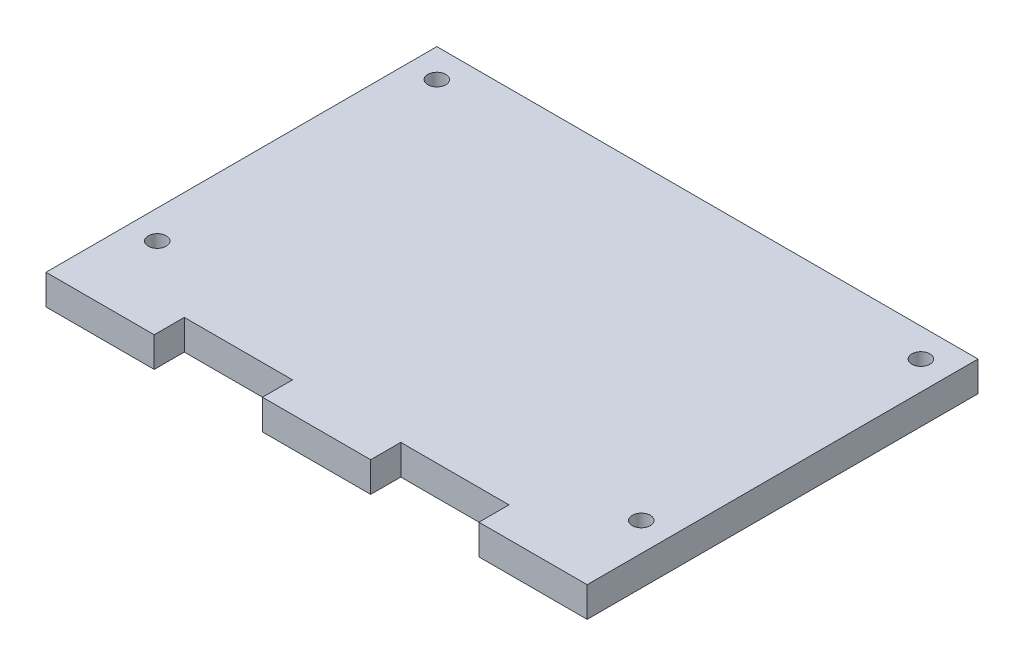
ISO-10303-21;
HEADER;
FILE_DESCRIPTION(('STEP AP214'),'2;1');
FILE_NAME('part.step','',(''),(''),'','','');
FILE_SCHEMA(('AUTOMOTIVE_DESIGN { 1 0 10303 214 1 1 1 1 }'));
ENDSEC;
DATA;
#1=APPLICATION_CONTEXT('core data for automotive mechanical design processes');
#2=APPLICATION_PROTOCOL_DEFINITION('international standard','automotive_design',2000,#1);
#3=PRODUCT_CONTEXT('',#1,'mechanical');
#4=PRODUCT('Part','Part','',(#3));
#5=PRODUCT_RELATED_PRODUCT_CATEGORY('part','',(#4));
#6=PRODUCT_DEFINITION_FORMATION('','',#4);
#7=PRODUCT_DEFINITION_CONTEXT('part definition',#1,'design');
#8=PRODUCT_DEFINITION('design','',#6,#7);
#9=PRODUCT_DEFINITION_SHAPE('','',#8);
#10=(LENGTH_UNIT() NAMED_UNIT(*) SI_UNIT(.MILLI.,.METRE.));
#11=(NAMED_UNIT(*) PLANE_ANGLE_UNIT() SI_UNIT($,.RADIAN.));
#12=(NAMED_UNIT(*) SI_UNIT($,.STERADIAN.) SOLID_ANGLE_UNIT());
#13=UNCERTAINTY_MEASURE_WITH_UNIT(LENGTH_MEASURE(1.E-05),#10,'distance_accuracy_value','');
#14=(GEOMETRIC_REPRESENTATION_CONTEXT(3) GLOBAL_UNCERTAINTY_ASSIGNED_CONTEXT((#13)) GLOBAL_UNIT_ASSIGNED_CONTEXT((#10,
#11,#12)) REPRESENTATION_CONTEXT('',''));
#15=CARTESIAN_POINT('',(0.,0.,0.));
#16=DIRECTION('',(0.,0.,1.));
#17=DIRECTION('',(1.,0.,0.));
#18=AXIS2_PLACEMENT_3D('',#15,#16,#17);
#19=CARTESIAN_POINT('',(0.,5.,5.));
#20=DIRECTION('',(0.,0.,-1.));
#21=DIRECTION('',(-1.,0.,0.));
#22=AXIS2_PLACEMENT_3D('',#19,#20,#21);
#23=PLANE('',#22);
#24=DIRECTION('',(1.,0.,0.));
#25=VECTOR('',#24,1.);
#26=CARTESIAN_POINT('',(0.,0.,5.));
#27=LINE('',#26,#25);
#28=CARTESIAN_POINT('',(0.,0.,5.));
#29=VERTEX_POINT('',#28);
#30=CARTESIAN_POINT('',(18.,0.,4.99999999999998));
#31=VERTEX_POINT('',#30);
#32=EDGE_CURVE('E223',#29,#31,#27,.T.);
#33=ORIENTED_EDGE('',*,*,#32,.T.);
#34=DIRECTION('',(0.,-1.,0.));
#35=VECTOR('',#34,1.);
#36=CARTESIAN_POINT('',(18.,5.,4.99999999999998));
#37=LINE('',#36,#35);
#38=CARTESIAN_POINT('',(18.,5.,4.99999999999998));
#39=VERTEX_POINT('',#38);
#40=EDGE_CURVE('E49',#39,#31,#37,.T.);
#41=ORIENTED_EDGE('',*,*,#40,.F.);
#42=DIRECTION('',(1.,0.,0.));
#43=VECTOR('',#42,1.);
#44=CARTESIAN_POINT('',(0.,5.,5.));
#45=LINE('',#44,#43);
#46=CARTESIAN_POINT('',(0.,5.,5.));
#47=VERTEX_POINT('',#46);
#48=EDGE_CURVE('E112',#47,#39,#45,.T.);
#49=ORIENTED_EDGE('',*,*,#48,.F.);
#50=DIRECTION('',(0.,-1.,0.));
#51=VECTOR('',#50,1.);
#52=CARTESIAN_POINT('',(0.,5.,5.));
#53=LINE('',#52,#51);
#54=EDGE_CURVE('E12',#47,#29,#53,.T.);
#55=ORIENTED_EDGE('',*,*,#54,.T.);
#56=EDGE_LOOP('',(#33,#41,#49,#55));
#57=FACE_BOUND('',#56,.T.);
#58=ADVANCED_FACE('F41',(#57),#23,.F.);
#59=CARTESIAN_POINT('',(18.,5.,0.));
#60=DIRECTION('',(-1.,0.,0.));
#61=DIRECTION('',(0.,0.,1.));
#62=AXIS2_PLACEMENT_3D('',#59,#60,#61);
#63=PLANE('',#62);
#64=DIRECTION('',(0.,0.,-1.));
#65=VECTOR('',#64,1.);
#66=CARTESIAN_POINT('',(18.,0.,0.));
#67=LINE('',#66,#65);
#68=CARTESIAN_POINT('',(18.,0.,0.));
#69=VERTEX_POINT('',#68);
#70=EDGE_CURVE('E290',#31,#69,#67,.T.);
#71=ORIENTED_EDGE('',*,*,#70,.T.);
#72=DIRECTION('',(0.,-1.,0.));
#73=VECTOR('',#72,1.);
#74=CARTESIAN_POINT('',(18.,5.,0.));
#75=LINE('',#74,#73);
#76=CARTESIAN_POINT('',(18.,5.,0.));
#77=VERTEX_POINT('',#76);
#78=EDGE_CURVE('E293',#77,#69,#75,.T.);
#79=ORIENTED_EDGE('',*,*,#78,.F.);
#80=DIRECTION('',(0.,0.,-1.));
#81=VECTOR('',#80,1.);
#82=CARTESIAN_POINT('',(18.,5.,0.));
#83=LINE('',#82,#81);
#84=EDGE_CURVE('E200',#39,#77,#83,.T.);
#85=ORIENTED_EDGE('',*,*,#84,.F.);
#86=ORIENTED_EDGE('',*,*,#40,.T.);
#87=EDGE_LOOP('',(#71,#79,#85,#86));
#88=FACE_BOUND('',#87,.T.);
#89=ADVANCED_FACE('F278',(#88),#63,.F.);
#90=CARTESIAN_POINT('',(18.,5.,0.));
#91=DIRECTION('',(0.,0.,-1.));
#92=DIRECTION('',(-1.,0.,0.));
#93=AXIS2_PLACEMENT_3D('',#90,#91,#92);
#94=PLANE('',#93);
#95=DIRECTION('',(1.,0.,0.));
#96=VECTOR('',#95,1.);
#97=CARTESIAN_POINT('',(18.,0.,0.));
#98=LINE('',#97,#96);
#99=CARTESIAN_POINT('',(36.,0.,0.));
#100=VERTEX_POINT('',#99);
#101=EDGE_CURVE('E296',#69,#100,#98,.T.);
#102=ORIENTED_EDGE('',*,*,#101,.T.);
#103=DIRECTION('',(0.,-1.,0.));
#104=VECTOR('',#103,1.);
#105=CARTESIAN_POINT('',(36.,5.,0.));
#106=LINE('',#105,#104);
#107=CARTESIAN_POINT('',(36.,5.,0.));
#108=VERTEX_POINT('',#107);
#109=EDGE_CURVE('E329',#108,#100,#106,.T.);
#110=ORIENTED_EDGE('',*,*,#109,.F.);
#111=DIRECTION('',(1.,0.,0.));
#112=VECTOR('',#111,1.);
#113=CARTESIAN_POINT('',(18.,5.,0.));
#114=LINE('',#113,#112);
#115=EDGE_CURVE('E196',#77,#108,#114,.T.);
#116=ORIENTED_EDGE('',*,*,#115,.F.);
#117=ORIENTED_EDGE('',*,*,#78,.T.);
#118=EDGE_LOOP('',(#102,#110,#116,#117));
#119=FACE_BOUND('',#118,.T.);
#120=ADVANCED_FACE('F282',(#119),#94,.F.);
#121=CARTESIAN_POINT('',(36.,5.,0.));
#122=DIRECTION('',(1.,0.,0.));
#123=DIRECTION('',(0.,0.,-1.));
#124=AXIS2_PLACEMENT_3D('',#121,#122,#123);
#125=PLANE('',#124);
#126=DIRECTION('',(0.,0.,1.));
#127=VECTOR('',#126,1.);
#128=CARTESIAN_POINT('',(36.,0.,0.));
#129=LINE('',#128,#127);
#130=CARTESIAN_POINT('',(36.,0.,4.99999999999998));
#131=VERTEX_POINT('',#130);
#132=EDGE_CURVE('E298',#100,#131,#129,.T.);
#133=ORIENTED_EDGE('',*,*,#132,.T.);
#134=DIRECTION('',(0.,-1.,0.));
#135=VECTOR('',#134,1.);
#136=CARTESIAN_POINT('',(36.,5.,4.99999999999998));
#137=LINE('',#136,#135);
#138=CARTESIAN_POINT('',(36.,5.,4.99999999999998));
#139=VERTEX_POINT('',#138);
#140=EDGE_CURVE('E326',#139,#131,#137,.T.);
#141=ORIENTED_EDGE('',*,*,#140,.F.);
#142=DIRECTION('',(0.,0.,1.));
#143=VECTOR('',#142,1.);
#144=CARTESIAN_POINT('',(36.,5.,0.));
#145=LINE('',#144,#143);
#146=EDGE_CURVE('E193',#108,#139,#145,.T.);
#147=ORIENTED_EDGE('',*,*,#146,.F.);
#148=ORIENTED_EDGE('',*,*,#109,.T.);
#149=EDGE_LOOP('',(#133,#141,#147,#148));
#150=FACE_BOUND('',#149,.T.);
#151=ADVANCED_FACE('F377',(#150),#125,.F.);
#152=CARTESIAN_POINT('',(36.,5.,4.99999999999998));
#153=DIRECTION('',(0.,0.,-1.));
#154=DIRECTION('',(-1.,0.,0.));
#155=AXIS2_PLACEMENT_3D('',#152,#153,#154);
#156=PLANE('',#155);
#157=DIRECTION('',(1.,0.,0.));
#158=VECTOR('',#157,1.);
#159=CARTESIAN_POINT('',(36.,0.,4.99999999999998));
#160=LINE('',#159,#158);
#161=CARTESIAN_POINT('',(54.,0.,4.99999999999998));
#162=VERTEX_POINT('',#161);
#163=EDGE_CURVE('E302',#131,#162,#160,.T.);
#164=ORIENTED_EDGE('',*,*,#163,.T.);
#165=DIRECTION('',(0.,-1.,0.));
#166=VECTOR('',#165,1.);
#167=CARTESIAN_POINT('',(54.,5.,4.99999999999998));
#168=LINE('',#167,#166);
#169=CARTESIAN_POINT('',(54.,5.,4.99999999999998));
#170=VERTEX_POINT('',#169);
#171=EDGE_CURVE('E323',#170,#162,#168,.T.);
#172=ORIENTED_EDGE('',*,*,#171,.F.);
#173=DIRECTION('',(1.,0.,0.));
#174=VECTOR('',#173,1.);
#175=CARTESIAN_POINT('',(36.,5.,4.99999999999998));
#176=LINE('',#175,#174);
#177=EDGE_CURVE('E185',#139,#170,#176,.T.);
#178=ORIENTED_EDGE('',*,*,#177,.F.);
#179=ORIENTED_EDGE('',*,*,#140,.T.);
#180=EDGE_LOOP('',(#164,#172,#178,#179));
#181=FACE_BOUND('',#180,.T.);
#182=ADVANCED_FACE('F344',(#181),#156,.F.);
#183=CARTESIAN_POINT('',(54.,5.,0.));
#184=DIRECTION('',(-1.,0.,0.));
#185=DIRECTION('',(0.,0.,1.));
#186=AXIS2_PLACEMENT_3D('',#183,#184,#185);
#187=PLANE('',#186);
#188=DIRECTION('',(0.,0.,-1.));
#189=VECTOR('',#188,1.);
#190=CARTESIAN_POINT('',(54.,0.,0.));
#191=LINE('',#190,#189);
#192=CARTESIAN_POINT('',(54.,0.,0.));
#193=VERTEX_POINT('',#192);
#194=EDGE_CURVE('E304',#162,#193,#191,.T.);
#195=ORIENTED_EDGE('',*,*,#194,.T.);
#196=DIRECTION('',(0.,-1.,0.));
#197=VECTOR('',#196,1.);
#198=CARTESIAN_POINT('',(54.,5.,0.));
#199=LINE('',#198,#197);
#200=CARTESIAN_POINT('',(54.,5.,0.));
#201=VERTEX_POINT('',#200);
#202=EDGE_CURVE('E320',#201,#193,#199,.T.);
#203=ORIENTED_EDGE('',*,*,#202,.F.);
#204=DIRECTION('',(0.,0.,-1.));
#205=VECTOR('',#204,1.);
#206=CARTESIAN_POINT('',(54.,5.,0.));
#207=LINE('',#206,#205);
#208=EDGE_CURVE('E181',#170,#201,#207,.T.);
#209=ORIENTED_EDGE('',*,*,#208,.F.);
#210=ORIENTED_EDGE('',*,*,#171,.T.);
#211=EDGE_LOOP('',(#195,#203,#209,#210));
#212=FACE_BOUND('',#211,.T.);
#213=ADVANCED_FACE('F348',(#212),#187,.F.);
#214=CARTESIAN_POINT('',(54.,5.,0.));
#215=DIRECTION('',(0.,0.,-1.));
#216=DIRECTION('',(-1.,0.,0.));
#217=AXIS2_PLACEMENT_3D('',#214,#215,#216);
#218=PLANE('',#217);
#219=DIRECTION('',(1.,0.,0.));
#220=VECTOR('',#219,1.);
#221=CARTESIAN_POINT('',(54.,0.,0.));
#222=LINE('',#221,#220);
#223=CARTESIAN_POINT('',(72.,0.,0.));
#224=VERTEX_POINT('',#223);
#225=EDGE_CURVE('E306',#193,#224,#222,.T.);
#226=ORIENTED_EDGE('',*,*,#225,.T.);
#227=DIRECTION('',(0.,-1.,0.));
#228=VECTOR('',#227,1.);
#229=CARTESIAN_POINT('',(72.,5.,0.));
#230=LINE('',#229,#228);
#231=CARTESIAN_POINT('',(72.,5.,0.));
#232=VERTEX_POINT('',#231);
#233=EDGE_CURVE('E317',#232,#224,#230,.T.);
#234=ORIENTED_EDGE('',*,*,#233,.F.);
#235=DIRECTION('',(1.,0.,0.));
#236=VECTOR('',#235,1.);
#237=CARTESIAN_POINT('',(54.,5.,0.));
#238=LINE('',#237,#236);
#239=EDGE_CURVE('E177',#201,#232,#238,.T.);
#240=ORIENTED_EDGE('',*,*,#239,.F.);
#241=ORIENTED_EDGE('',*,*,#202,.T.);
#242=EDGE_LOOP('',(#226,#234,#240,#241));
#243=FACE_BOUND('',#242,.T.);
#244=ADVANCED_FACE('F353',(#243),#218,.F.);
#245=CARTESIAN_POINT('',(72.,5.,0.));
#246=DIRECTION('',(1.,0.,0.));
#247=DIRECTION('',(0.,0.,-1.));
#248=AXIS2_PLACEMENT_3D('',#245,#246,#247);
#249=PLANE('',#248);
#250=DIRECTION('',(0.,0.,1.));
#251=VECTOR('',#250,1.);
#252=CARTESIAN_POINT('',(72.,0.,0.));
#253=LINE('',#252,#251);
#254=CARTESIAN_POINT('',(72.,0.,4.99999999999998));
#255=VERTEX_POINT('',#254);
#256=EDGE_CURVE('E308',#224,#255,#253,.T.);
#257=ORIENTED_EDGE('',*,*,#256,.T.);
#258=DIRECTION('',(0.,-1.,0.));
#259=VECTOR('',#258,1.);
#260=CARTESIAN_POINT('',(72.,5.,4.99999999999998));
#261=LINE('',#260,#259);
#262=CARTESIAN_POINT('',(72.,5.,4.99999999999998));
#263=VERTEX_POINT('',#262);
#264=EDGE_CURVE('E155',#263,#255,#261,.T.);
#265=ORIENTED_EDGE('',*,*,#264,.F.);
#266=DIRECTION('',(0.,0.,1.));
#267=VECTOR('',#266,1.);
#268=CARTESIAN_POINT('',(72.,5.,0.));
#269=LINE('',#268,#267);
#270=EDGE_CURVE('E144',#232,#263,#269,.T.);
#271=ORIENTED_EDGE('',*,*,#270,.F.);
#272=ORIENTED_EDGE('',*,*,#233,.T.);
#273=EDGE_LOOP('',(#257,#265,#271,#272));
#274=FACE_BOUND('',#273,.T.);
#275=ADVANCED_FACE('F356',(#274),#249,.F.);
#276=CARTESIAN_POINT('',(72.,5.,4.99999999999998));
#277=DIRECTION('',(0.,0.,-1.));
#278=DIRECTION('',(-1.,0.,0.));
#279=AXIS2_PLACEMENT_3D('',#276,#277,#278);
#280=PLANE('',#279);
#281=DIRECTION('',(1.,0.,0.));
#282=VECTOR('',#281,1.);
#283=CARTESIAN_POINT('',(72.,0.,4.99999999999998));
#284=LINE('',#283,#282);
#285=CARTESIAN_POINT('',(90.,0.,4.99999999999998));
#286=VERTEX_POINT('',#285);
#287=EDGE_CURVE('E154',#255,#286,#284,.T.);
#288=ORIENTED_EDGE('',*,*,#287,.T.);
#289=DIRECTION('',(0.,-1.,0.));
#290=VECTOR('',#289,1.);
#291=CARTESIAN_POINT('',(90.,5.,4.99999999999998));
#292=LINE('',#291,#290);
#293=CARTESIAN_POINT('',(90.,5.,4.99999999999998));
#294=VERTEX_POINT('',#293);
#295=EDGE_CURVE('E151',#294,#286,#292,.T.);
#296=ORIENTED_EDGE('',*,*,#295,.F.);
#297=DIRECTION('',(1.,0.,0.));
#298=VECTOR('',#297,1.);
#299=CARTESIAN_POINT('',(72.,5.,4.99999999999998));
#300=LINE('',#299,#298);
#301=EDGE_CURVE('E138',#263,#294,#300,.T.);
#302=ORIENTED_EDGE('',*,*,#301,.F.);
#303=ORIENTED_EDGE('',*,*,#264,.T.);
#304=EDGE_LOOP('',(#288,#296,#302,#303));
#305=FACE_BOUND('',#304,.T.);
#306=ADVANCED_FACE('F152',(#305),#280,.F.);
#307=CARTESIAN_POINT('',(90.,5.,0.));
#308=DIRECTION('',(-1.,0.,0.));
#309=DIRECTION('',(0.,0.,1.));
#310=AXIS2_PLACEMENT_3D('',#307,#308,#309);
#311=PLANE('',#310);
#312=DIRECTION('',(0.,0.,-1.));
#313=VECTOR('',#312,1.);
#314=CARTESIAN_POINT('',(90.,0.,0.));
#315=LINE('',#314,#313);
#316=CARTESIAN_POINT('',(90.,0.,-60.));
#317=VERTEX_POINT('',#316);
#318=EDGE_CURVE('E98',#286,#317,#315,.T.);
#319=ORIENTED_EDGE('',*,*,#318,.T.);
#320=DIRECTION('',(0.,-1.,0.));
#321=VECTOR('',#320,1.);
#322=CARTESIAN_POINT('',(90.,5.,-60.));
#323=LINE('',#322,#321);
#324=CARTESIAN_POINT('',(90.,5.,-60.));
#325=VERTEX_POINT('',#324);
#326=EDGE_CURVE('E156',#325,#317,#323,.T.);
#327=ORIENTED_EDGE('',*,*,#326,.F.);
#328=DIRECTION('',(0.,0.,-1.));
#329=VECTOR('',#328,1.);
#330=CARTESIAN_POINT('',(90.,5.,0.));
#331=LINE('',#330,#329);
#332=EDGE_CURVE('E142',#294,#325,#331,.T.);
#333=ORIENTED_EDGE('',*,*,#332,.F.);
#334=ORIENTED_EDGE('',*,*,#295,.T.);
#335=EDGE_LOOP('',(#319,#327,#333,#334));
#336=FACE_BOUND('',#335,.T.);
#337=ADVANCED_FACE('F158',(#336),#311,.F.);
#338=CARTESIAN_POINT('',(0.,5.,-60.));
#339=DIRECTION('',(0.,0.,1.));
#340=DIRECTION('',(1.,0.,0.));
#341=AXIS2_PLACEMENT_3D('',#338,#339,#340);
#342=PLANE('',#341);
#343=DIRECTION('',(-1.,0.,0.));
#344=VECTOR('',#343,1.);
#345=CARTESIAN_POINT('',(0.,0.,-60.));
#346=LINE('',#345,#344);
#347=CARTESIAN_POINT('',(0.,0.,-60.));
#348=VERTEX_POINT('',#347);
#349=EDGE_CURVE('E105',#317,#348,#346,.T.);
#350=ORIENTED_EDGE('',*,*,#349,.T.);
#351=DIRECTION('',(0.,-1.,0.));
#352=VECTOR('',#351,1.);
#353=CARTESIAN_POINT('',(0.,5.,-60.));
#354=LINE('',#353,#352);
#355=CARTESIAN_POINT('',(0.,5.,-60.));
#356=VERTEX_POINT('',#355);
#357=EDGE_CURVE('E164',#356,#348,#354,.T.);
#358=ORIENTED_EDGE('',*,*,#357,.F.);
#359=DIRECTION('',(-1.,0.,0.));
#360=VECTOR('',#359,1.);
#361=CARTESIAN_POINT('',(0.,5.,-60.));
#362=LINE('',#361,#360);
#363=EDGE_CURVE('E161',#325,#356,#362,.T.);
#364=ORIENTED_EDGE('',*,*,#363,.F.);
#365=ORIENTED_EDGE('',*,*,#326,.T.);
#366=EDGE_LOOP('',(#350,#358,#364,#365));
#367=FACE_BOUND('',#366,.T.);
#368=ADVANCED_FACE('F357',(#367),#342,.F.);
#369=CARTESIAN_POINT('',(0.,5.,0.));
#370=DIRECTION('',(1.,0.,0.));
#371=DIRECTION('',(0.,0.,-1.));
#372=AXIS2_PLACEMENT_3D('',#369,#370,#371);
#373=PLANE('',#372);
#374=DIRECTION('',(0.,0.,1.));
#375=VECTOR('',#374,1.);
#376=CARTESIAN_POINT('',(0.,0.,0.));
#377=LINE('',#376,#375);
#378=EDGE_CURVE('E213',#348,#29,#377,.T.);
#379=ORIENTED_EDGE('',*,*,#378,.T.);
#380=ORIENTED_EDGE('',*,*,#54,.F.);
#381=DIRECTION('',(0.,0.,1.));
#382=VECTOR('',#381,1.);
#383=CARTESIAN_POINT('',(0.,5.,0.));
#384=LINE('',#383,#382);
#385=EDGE_CURVE('E57',#356,#47,#384,.T.);
#386=ORIENTED_EDGE('',*,*,#385,.F.);
#387=ORIENTED_EDGE('',*,*,#357,.T.);
#388=EDGE_LOOP('',(#379,#380,#386,#387));
#389=FACE_BOUND('',#388,.T.);
#390=ADVANCED_FACE('F262',(#389),#373,.F.);
#391=CARTESIAN_POINT('',(0.,5.,0.));
#392=DIRECTION('',(0.,1.,0.));
#393=DIRECTION('',(0.,0.,1.));
#394=AXIS2_PLACEMENT_3D('',#391,#392,#393);
#395=PLANE('',#394);
#396=CARTESIAN_POINT('',(4.74999999999999,5.,-8.75000000000001));
#397=DIRECTION('',(0.,1.,0.));
#398=DIRECTION('',(0.,0.,1.));
#399=AXIS2_PLACEMENT_3D('',#396,#397,#398);
#400=CIRCLE('',#399,1.5);
#401=CARTESIAN_POINT('',(4.74999999999999,5.,-7.25000000000001));
#402=VERTEX_POINT('',#401);
#403=EDGE_CURVE('E224',#402,#402,#400,.T.);
#404=ORIENTED_EDGE('',*,*,#403,.F.);
#405=EDGE_LOOP('',(#404));
#406=FACE_BOUND('',#405,.T.);
#407=CARTESIAN_POINT('',(85.25,5.,-8.75000000000001));
#408=DIRECTION('',(0.,1.,0.));
#409=DIRECTION('',(0.,0.,1.));
#410=AXIS2_PLACEMENT_3D('',#407,#408,#409);
#411=CIRCLE('',#410,1.5);
#412=CARTESIAN_POINT('',(85.25,5.,-7.25000000000001));
#413=VERTEX_POINT('',#412);
#414=EDGE_CURVE('E234',#413,#413,#411,.T.);
#415=ORIENTED_EDGE('',*,*,#414,.F.);
#416=EDGE_LOOP('',(#415));
#417=FACE_BOUND('',#416,.T.);
#418=CARTESIAN_POINT('',(85.25,5.,-55.25));
#419=DIRECTION('',(0.,1.,0.));
#420=DIRECTION('',(0.,0.,1.));
#421=AXIS2_PLACEMENT_3D('',#418,#419,#420);
#422=CIRCLE('',#421,1.5);
#423=CARTESIAN_POINT('',(85.25,5.,-53.75));
#424=VERTEX_POINT('',#423);
#425=EDGE_CURVE('E241',#424,#424,#422,.T.);
#426=ORIENTED_EDGE('',*,*,#425,.F.);
#427=EDGE_LOOP('',(#426));
#428=FACE_BOUND('',#427,.T.);
#429=CARTESIAN_POINT('',(4.74999999999999,5.,-55.25));
#430=DIRECTION('',(0.,1.,0.));
#431=DIRECTION('',(0.,0.,1.));
#432=AXIS2_PLACEMENT_3D('',#429,#430,#431);
#433=CIRCLE('',#432,1.5);
#434=CARTESIAN_POINT('',(4.74999999999999,5.,-53.75));
#435=VERTEX_POINT('',#434);
#436=EDGE_CURVE('E214',#435,#435,#433,.T.);
#437=ORIENTED_EDGE('',*,*,#436,.F.);
#438=EDGE_LOOP('',(#437));
#439=FACE_BOUND('',#438,.T.);
#440=ORIENTED_EDGE('',*,*,#385,.T.);
#441=ORIENTED_EDGE('',*,*,#48,.T.);
#442=ORIENTED_EDGE('',*,*,#84,.T.);
#443=ORIENTED_EDGE('',*,*,#115,.T.);
#444=ORIENTED_EDGE('',*,*,#146,.T.);
#445=ORIENTED_EDGE('',*,*,#177,.T.);
#446=ORIENTED_EDGE('',*,*,#208,.T.);
#447=ORIENTED_EDGE('',*,*,#239,.T.);
#448=ORIENTED_EDGE('',*,*,#270,.T.);
#449=ORIENTED_EDGE('',*,*,#301,.T.);
#450=ORIENTED_EDGE('',*,*,#332,.T.);
#451=ORIENTED_EDGE('',*,*,#363,.T.);
#452=EDGE_LOOP('',(#440,#441,#442,#443,#444,#445,#446,#447,#448,#449,#450,#451));
#453=FACE_BOUND('',#452,.T.);
#454=ADVANCED_FACE('F140',(#406,#417,#428,#439,#453),#395,.T.);
#455=CARTESIAN_POINT('',(0.,0.,0.));
#456=DIRECTION('',(0.,1.,0.));
#457=DIRECTION('',(0.,0.,1.));
#458=AXIS2_PLACEMENT_3D('',#455,#456,#457);
#459=PLANE('',#458);
#460=CARTESIAN_POINT('',(4.74999999999999,0.,-8.75000000000001));
#461=DIRECTION('',(0.,1.,0.));
#462=DIRECTION('',(0.,0.,1.));
#463=AXIS2_PLACEMENT_3D('',#460,#461,#462);
#464=CIRCLE('',#463,1.5);
#465=CARTESIAN_POINT('',(4.74999999999999,0.,-7.25000000000001));
#466=VERTEX_POINT('',#465);
#467=EDGE_CURVE('E229',#466,#466,#464,.T.);
#468=ORIENTED_EDGE('',*,*,#467,.T.);
#469=EDGE_LOOP('',(#468));
#470=FACE_BOUND('',#469,.T.);
#471=CARTESIAN_POINT('',(85.25,0.,-8.75000000000001));
#472=DIRECTION('',(0.,1.,0.));
#473=DIRECTION('',(0.,0.,1.));
#474=AXIS2_PLACEMENT_3D('',#471,#472,#473);
#475=CIRCLE('',#474,1.5);
#476=CARTESIAN_POINT('',(85.25,0.,-7.25000000000001));
#477=VERTEX_POINT('',#476);
#478=EDGE_CURVE('E239',#477,#477,#475,.T.);
#479=ORIENTED_EDGE('',*,*,#478,.T.);
#480=EDGE_LOOP('',(#479));
#481=FACE_BOUND('',#480,.T.);
#482=CARTESIAN_POINT('',(85.25,0.,-55.25));
#483=DIRECTION('',(0.,1.,0.));
#484=DIRECTION('',(0.,0.,1.));
#485=AXIS2_PLACEMENT_3D('',#482,#483,#484);
#486=CIRCLE('',#485,1.5);
#487=CARTESIAN_POINT('',(85.25,0.,-53.75));
#488=VERTEX_POINT('',#487);
#489=EDGE_CURVE('E220',#488,#488,#486,.T.);
#490=ORIENTED_EDGE('',*,*,#489,.T.);
#491=EDGE_LOOP('',(#490));
#492=FACE_BOUND('',#491,.T.);
#493=CARTESIAN_POINT('',(4.74999999999999,0.,-55.25));
#494=DIRECTION('',(0.,1.,0.));
#495=DIRECTION('',(0.,0.,1.));
#496=AXIS2_PLACEMENT_3D('',#493,#494,#495);
#497=CIRCLE('',#496,1.5);
#498=CARTESIAN_POINT('',(4.74999999999999,0.,-53.75));
#499=VERTEX_POINT('',#498);
#500=EDGE_CURVE('E219',#499,#499,#497,.T.);
#501=ORIENTED_EDGE('',*,*,#500,.T.);
#502=EDGE_LOOP('',(#501));
#503=FACE_BOUND('',#502,.T.);
#504=ORIENTED_EDGE('',*,*,#32,.F.);
#505=ORIENTED_EDGE('',*,*,#378,.F.);
#506=ORIENTED_EDGE('',*,*,#349,.F.);
#507=ORIENTED_EDGE('',*,*,#318,.F.);
#508=ORIENTED_EDGE('',*,*,#287,.F.);
#509=ORIENTED_EDGE('',*,*,#256,.F.);
#510=ORIENTED_EDGE('',*,*,#225,.F.);
#511=ORIENTED_EDGE('',*,*,#194,.F.);
#512=ORIENTED_EDGE('',*,*,#163,.F.);
#513=ORIENTED_EDGE('',*,*,#132,.F.);
#514=ORIENTED_EDGE('',*,*,#101,.F.);
#515=ORIENTED_EDGE('',*,*,#70,.F.);
#516=EDGE_LOOP('',(#504,#505,#506,#507,#508,#509,#510,#511,#512,#513,#514,#515));
#517=FACE_BOUND('',#516,.T.);
#518=ADVANCED_FACE('F249',(#470,#481,#492,#503,#517),#459,.F.);
#519=CARTESIAN_POINT('',(4.74999999999999,0.,-55.25));
#520=DIRECTION('',(0.,1.,0.));
#521=DIRECTION('',(0.,0.,1.));
#522=AXIS2_PLACEMENT_3D('',#519,#520,#521);
#523=CYLINDRICAL_SURFACE('',#522,1.5);
#524=ORIENTED_EDGE('',*,*,#500,.F.);
#525=EDGE_LOOP('',(#524));
#526=FACE_BOUND('',#525,.T.);
#527=ORIENTED_EDGE('',*,*,#436,.T.);
#528=EDGE_LOOP('',(#527));
#529=FACE_BOUND('',#528,.T.);
#530=ADVANCED_FACE('F256',(#526,#529),#523,.F.);
#531=CARTESIAN_POINT('',(85.25,0.,-55.25));
#532=DIRECTION('',(0.,1.,0.));
#533=DIRECTION('',(0.,0.,1.));
#534=AXIS2_PLACEMENT_3D('',#531,#532,#533);
#535=CYLINDRICAL_SURFACE('',#534,1.5);
#536=ORIENTED_EDGE('',*,*,#489,.F.);
#537=EDGE_LOOP('',(#536));
#538=FACE_BOUND('',#537,.T.);
#539=ORIENTED_EDGE('',*,*,#425,.T.);
#540=EDGE_LOOP('',(#539));
#541=FACE_BOUND('',#540,.T.);
#542=ADVANCED_FACE('F252',(#538,#541),#535,.F.);
#543=CARTESIAN_POINT('',(85.25,0.,-8.75000000000001));
#544=DIRECTION('',(0.,1.,0.));
#545=DIRECTION('',(0.,0.,1.));
#546=AXIS2_PLACEMENT_3D('',#543,#544,#545);
#547=CYLINDRICAL_SURFACE('',#546,1.5);
#548=ORIENTED_EDGE('',*,*,#478,.F.);
#549=EDGE_LOOP('',(#548));
#550=FACE_BOUND('',#549,.T.);
#551=ORIENTED_EDGE('',*,*,#414,.T.);
#552=EDGE_LOOP('',(#551));
#553=FACE_BOUND('',#552,.T.);
#554=ADVANCED_FACE('F255',(#550,#553),#547,.F.);
#555=CARTESIAN_POINT('',(4.74999999999999,0.,-8.75000000000001));
#556=DIRECTION('',(0.,1.,0.));
#557=DIRECTION('',(0.,0.,1.));
#558=AXIS2_PLACEMENT_3D('',#555,#556,#557);
#559=CYLINDRICAL_SURFACE('',#558,1.5);
#560=ORIENTED_EDGE('',*,*,#467,.F.);
#561=EDGE_LOOP('',(#560));
#562=FACE_BOUND('',#561,.T.);
#563=ORIENTED_EDGE('',*,*,#403,.T.);
#564=EDGE_LOOP('',(#563));
#565=FACE_BOUND('',#564,.T.);
#566=ADVANCED_FACE('F457',(#562,#565),#559,.F.);
#567=CLOSED_SHELL('',(#58,#89,#120,#151,#182,#213,#244,#275,#306,#337,#368,#390,#454,#518,#530,
#542,#554,#566));
#568=MANIFOLD_SOLID_BREP('B2',#567);
#569=ADVANCED_BREP_SHAPE_REPRESENTATION('',(#18,#568),#14);
#570=SHAPE_DEFINITION_REPRESENTATION(#9,#569);
ENDSEC;
END-ISO-10303-21;
